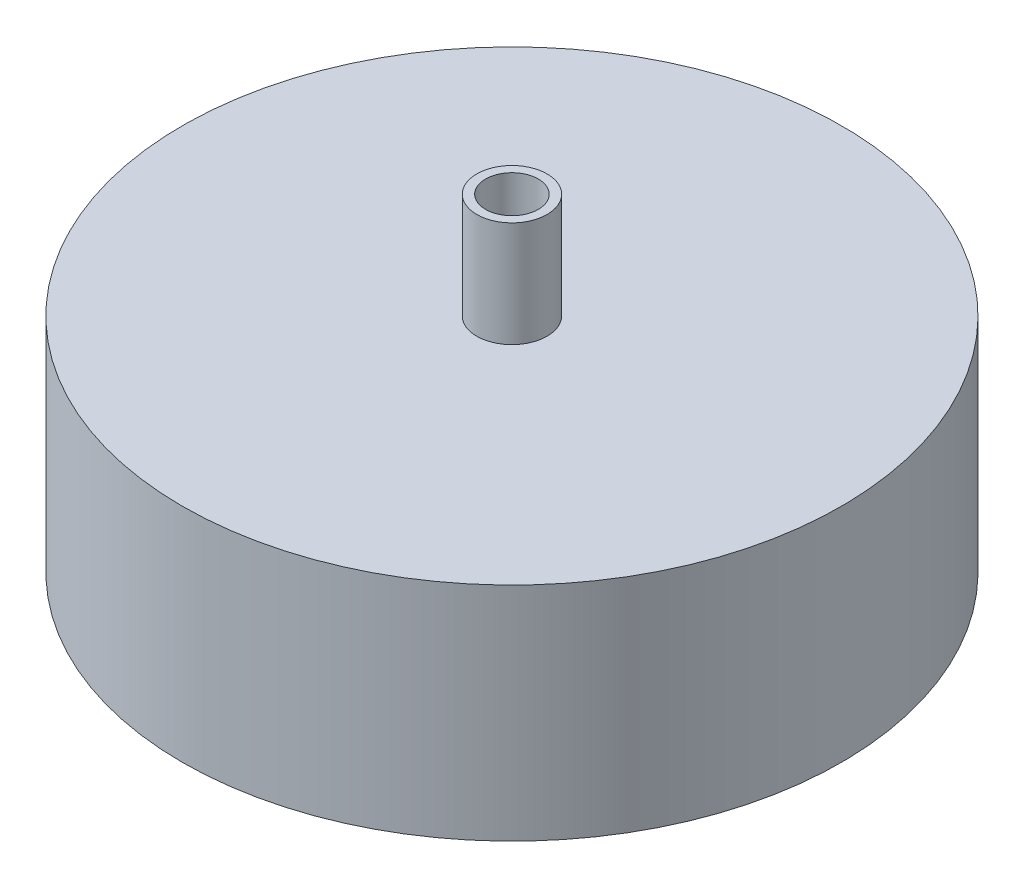
ISO-10303-21;
HEADER;
FILE_DESCRIPTION(('STEP AP214'),'2;1');
FILE_NAME('part.step','',(''),(''),'','','');
FILE_SCHEMA(('AUTOMOTIVE_DESIGN { 1 0 10303 214 1 1 1 1 }'));
ENDSEC;
DATA;
#1=APPLICATION_CONTEXT('core data for automotive mechanical design processes');
#2=APPLICATION_PROTOCOL_DEFINITION('international standard','automotive_design',2000,#1);
#3=PRODUCT_CONTEXT('',#1,'mechanical');
#4=PRODUCT('Part','Part','',(#3));
#5=PRODUCT_RELATED_PRODUCT_CATEGORY('part','',(#4));
#6=PRODUCT_DEFINITION_FORMATION('','',#4);
#7=PRODUCT_DEFINITION_CONTEXT('part definition',#1,'design');
#8=PRODUCT_DEFINITION('design','',#6,#7);
#9=PRODUCT_DEFINITION_SHAPE('','',#8);
#10=(LENGTH_UNIT() NAMED_UNIT(*) SI_UNIT(.MILLI.,.METRE.));
#11=(NAMED_UNIT(*) PLANE_ANGLE_UNIT() SI_UNIT($,.RADIAN.));
#12=(NAMED_UNIT(*) SI_UNIT($,.STERADIAN.) SOLID_ANGLE_UNIT());
#13=UNCERTAINTY_MEASURE_WITH_UNIT(LENGTH_MEASURE(1.E-05),#10,'distance_accuracy_value','');
#14=(GEOMETRIC_REPRESENTATION_CONTEXT(3) GLOBAL_UNCERTAINTY_ASSIGNED_CONTEXT((#13)) GLOBAL_UNIT_ASSIGNED_CONTEXT((#10,
#11,#12)) REPRESENTATION_CONTEXT('',''));
#15=CARTESIAN_POINT('',(0.,0.,0.));
#16=DIRECTION('',(0.,0.,1.));
#17=DIRECTION('',(1.,0.,0.));
#18=AXIS2_PLACEMENT_3D('',#15,#16,#17);
#19=CARTESIAN_POINT('',(0.,25.24,0.));
#20=DIRECTION('',(0.,-1.,0.));
#21=DIRECTION('',(0.,0.,-1.));
#22=AXIS2_PLACEMENT_3D('',#19,#20,#21);
#23=CYLINDRICAL_SURFACE('',#22,37.5);
#24=CARTESIAN_POINT('',(0.,25.24,0.));
#25=DIRECTION('',(0.,1.,0.));
#26=DIRECTION('',(0.,0.,1.));
#27=AXIS2_PLACEMENT_3D('',#24,#25,#26);
#28=CIRCLE('',#27,37.5);
#29=CARTESIAN_POINT('',(0.,25.24,37.5));
#30=VERTEX_POINT('',#29);
#31=EDGE_CURVE('E10',#30,#30,#28,.T.);
#32=ORIENTED_EDGE('',*,*,#31,.F.);
#33=EDGE_LOOP('',(#32));
#34=FACE_BOUND('',#33,.T.);
#35=CARTESIAN_POINT('',(0.,0.,0.));
#36=DIRECTION('',(0.,1.,0.));
#37=DIRECTION('',(0.,0.,1.));
#38=AXIS2_PLACEMENT_3D('',#35,#36,#37);
#39=CIRCLE('',#38,37.5);
#40=CARTESIAN_POINT('',(0.,0.,37.5));
#41=VERTEX_POINT('',#40);
#42=EDGE_CURVE('E40',#41,#41,#39,.T.);
#43=ORIENTED_EDGE('',*,*,#42,.T.);
#44=EDGE_LOOP('',(#43));
#45=FACE_BOUND('',#44,.T.);
#46=ADVANCED_FACE('F37',(#34,#45),#23,.T.);
#47=CARTESIAN_POINT('',(0.,25.24,0.));
#48=DIRECTION('',(0.,1.,0.));
#49=DIRECTION('',(0.,0.,1.));
#50=AXIS2_PLACEMENT_3D('',#47,#48,#49);
#51=PLANE('',#50);
#52=CARTESIAN_POINT('',(0.,25.24,0.));
#53=DIRECTION('',(0.,1.,0.));
#54=DIRECTION('',(0.,0.,1.));
#55=AXIS2_PLACEMENT_3D('',#52,#53,#54);
#56=CIRCLE('',#55,4.);
#57=CARTESIAN_POINT('',(0.,25.24,4.));
#58=VERTEX_POINT('',#57);
#59=EDGE_CURVE('E49',#58,#58,#56,.T.);
#60=ORIENTED_EDGE('',*,*,#59,.F.);
#61=EDGE_LOOP('',(#60));
#62=FACE_BOUND('',#61,.T.);
#63=ORIENTED_EDGE('',*,*,#31,.T.);
#64=EDGE_LOOP('',(#63));
#65=FACE_BOUND('',#64,.T.);
#66=ADVANCED_FACE('F67',(#62,#65),#51,.T.);
#67=CARTESIAN_POINT('',(0.,0.,0.));
#68=DIRECTION('',(0.,1.,0.));
#69=DIRECTION('',(0.,0.,1.));
#70=AXIS2_PLACEMENT_3D('',#67,#68,#69);
#71=PLANE('',#70);
#72=CARTESIAN_POINT('',(0.,0.,0.));
#73=DIRECTION('',(0.,1.,0.));
#74=DIRECTION('',(0.,0.,1.));
#75=AXIS2_PLACEMENT_3D('',#72,#73,#74);
#76=CIRCLE('',#75,3.);
#77=CARTESIAN_POINT('',(0.,0.,3.));
#78=VERTEX_POINT('',#77);
#79=EDGE_CURVE('E57',#78,#78,#76,.F.);
#80=ORIENTED_EDGE('',*,*,#79,.F.);
#81=EDGE_LOOP('',(#80));
#82=FACE_BOUND('',#81,.T.);
#83=ORIENTED_EDGE('',*,*,#42,.F.);
#84=EDGE_LOOP('',(#83));
#85=FACE_BOUND('',#84,.T.);
#86=ADVANCED_FACE('F63',(#82,#85),#71,.F.);
#87=CARTESIAN_POINT('',(0.,37.24,0.));
#88=DIRECTION('',(0.,1.,0.));
#89=DIRECTION('',(0.,0.,1.));
#90=AXIS2_PLACEMENT_3D('',#87,#88,#89);
#91=PLANE('',#90);
#92=CARTESIAN_POINT('',(0.,37.24,0.));
#93=DIRECTION('',(0.,1.,0.));
#94=DIRECTION('',(0.,0.,1.));
#95=AXIS2_PLACEMENT_3D('',#92,#93,#94);
#96=CIRCLE('',#95,4.);
#97=CARTESIAN_POINT('',(0.,37.24,4.));
#98=VERTEX_POINT('',#97);
#99=EDGE_CURVE('E47',#98,#98,#96,.T.);
#100=ORIENTED_EDGE('',*,*,#99,.T.);
#101=EDGE_LOOP('',(#100));
#102=FACE_BOUND('',#101,.T.);
#103=CARTESIAN_POINT('',(0.,37.24,0.));
#104=DIRECTION('',(0.,1.,0.));
#105=DIRECTION('',(0.,0.,1.));
#106=AXIS2_PLACEMENT_3D('',#103,#104,#105);
#107=CIRCLE('',#106,3.);
#108=CARTESIAN_POINT('',(0.,37.24,3.));
#109=VERTEX_POINT('',#108);
#110=EDGE_CURVE('E52',#109,#109,#107,.T.);
#111=ORIENTED_EDGE('',*,*,#110,.F.);
#112=EDGE_LOOP('',(#111));
#113=FACE_BOUND('',#112,.T.);
#114=ADVANCED_FACE('F66',(#102,#113),#91,.T.);
#115=CARTESIAN_POINT('',(0.,37.24,0.));
#116=DIRECTION('',(0.,-1.,0.));
#117=DIRECTION('',(0.,0.,-1.));
#118=AXIS2_PLACEMENT_3D('',#115,#116,#117);
#119=CYLINDRICAL_SURFACE('',#118,4.);
#120=ORIENTED_EDGE('',*,*,#99,.F.);
#121=EDGE_LOOP('',(#120));
#122=FACE_BOUND('',#121,.T.);
#123=ORIENTED_EDGE('',*,*,#59,.T.);
#124=EDGE_LOOP('',(#123));
#125=FACE_BOUND('',#124,.T.);
#126=ADVANCED_FACE('F82',(#122,#125),#119,.T.);
#127=CARTESIAN_POINT('',(0.,37.24,0.));
#128=DIRECTION('',(0.,-1.,0.));
#129=DIRECTION('',(0.,0.,-1.));
#130=AXIS2_PLACEMENT_3D('',#127,#128,#129);
#131=CYLINDRICAL_SURFACE('',#130,3.);
#132=ORIENTED_EDGE('',*,*,#110,.T.);
#133=EDGE_LOOP('',(#132));
#134=FACE_BOUND('',#133,.T.);
#135=ORIENTED_EDGE('',*,*,#79,.T.);
#136=EDGE_LOOP('',(#135));
#137=FACE_BOUND('',#136,.T.);
#138=ADVANCED_FACE('F61',(#134,#137),#131,.F.);
#139=CLOSED_SHELL('',(#46,#66,#86,#114,#126,#138));
#140=MANIFOLD_SOLID_BREP('B2',#139);
#141=ADVANCED_BREP_SHAPE_REPRESENTATION('',(#18,#140),#14);
#142=SHAPE_DEFINITION_REPRESENTATION(#9,#141);
ENDSEC;
END-ISO-10303-21;
